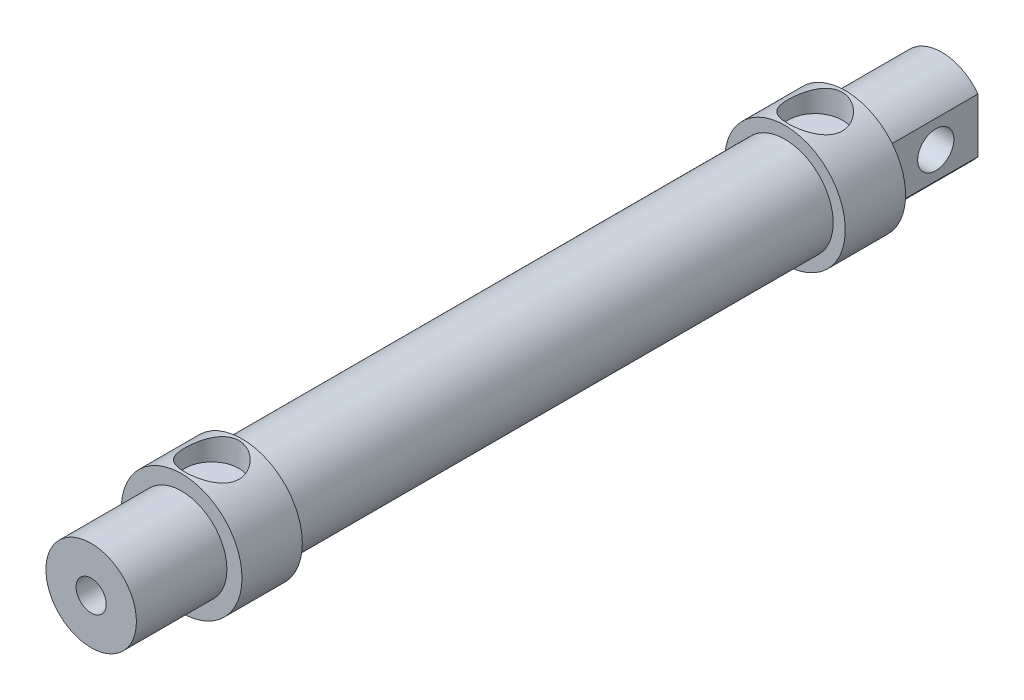
ISO-10303-21;
HEADER;
FILE_DESCRIPTION(('STEP AP214'),'2;1');
FILE_NAME('part.step','',(''),(''),'','','');
FILE_SCHEMA(('AUTOMOTIVE_DESIGN { 1 0 10303 214 1 1 1 1 }'));
ENDSEC;
DATA;
#1=APPLICATION_CONTEXT('core data for automotive mechanical design processes');
#2=APPLICATION_PROTOCOL_DEFINITION('international standard','automotive_design',2000,#1);
#3=PRODUCT_CONTEXT('',#1,'mechanical');
#4=PRODUCT('Part','Part','',(#3));
#5=PRODUCT_RELATED_PRODUCT_CATEGORY('part','',(#4));
#6=PRODUCT_DEFINITION_FORMATION('','',#4);
#7=PRODUCT_DEFINITION_CONTEXT('part definition',#1,'design');
#8=PRODUCT_DEFINITION('design','',#6,#7);
#9=PRODUCT_DEFINITION_SHAPE('','',#8);
#10=(LENGTH_UNIT() NAMED_UNIT(*) SI_UNIT(.MILLI.,.METRE.));
#11=(NAMED_UNIT(*) PLANE_ANGLE_UNIT() SI_UNIT($,.RADIAN.));
#12=(NAMED_UNIT(*) SI_UNIT($,.STERADIAN.) SOLID_ANGLE_UNIT());
#13=UNCERTAINTY_MEASURE_WITH_UNIT(LENGTH_MEASURE(1.E-05),#10,'distance_accuracy_value','');
#14=(GEOMETRIC_REPRESENTATION_CONTEXT(3) GLOBAL_UNCERTAINTY_ASSIGNED_CONTEXT((#13)) GLOBAL_UNIT_ASSIGNED_CONTEXT((#10,
#11,#12)) REPRESENTATION_CONTEXT('',''));
#15=CARTESIAN_POINT('',(0.,0.,0.));
#16=DIRECTION('',(0.,0.,1.));
#17=DIRECTION('',(1.,0.,0.));
#18=AXIS2_PLACEMENT_3D('',#15,#16,#17);
#19=CARTESIAN_POINT('',(0.,0.,-26.));
#20=DIRECTION('',(0.,0.,1.));
#21=DIRECTION('',(1.,0.,0.));
#22=AXIS2_PLACEMENT_3D('',#19,#20,#21);
#23=CYLINDRICAL_SURFACE('',#22,7.5);
#24=CARTESIAN_POINT('',(0.,0.,-26.));
#25=DIRECTION('',(0.,0.,-1.));
#26=DIRECTION('',(-1.,0.,0.));
#27=AXIS2_PLACEMENT_3D('',#24,#25,#26);
#28=CIRCLE('',#27,7.5);
#29=CARTESIAN_POINT('',(6.,-4.5,-26.));
#30=VERTEX_POINT('',#29);
#31=CARTESIAN_POINT('',(-6.,-4.5,-26.));
#32=VERTEX_POINT('',#31);
#33=EDGE_CURVE('E97',#30,#32,#28,.T.);
#34=ORIENTED_EDGE('',*,*,#33,.F.);
#35=DIRECTION('',(0.,0.,-1.));
#36=VECTOR('',#35,1.);
#37=CARTESIAN_POINT('',(6.,-4.5,-0.875856204552675));
#38=LINE('',#37,#36);
#39=CARTESIAN_POINT('',(6.,-4.5,-10.));
#40=VERTEX_POINT('',#39);
#41=EDGE_CURVE('E51',#40,#30,#38,.T.);
#42=ORIENTED_EDGE('',*,*,#41,.F.);
#43=CARTESIAN_POINT('',(0.,0.,-10.));
#44=DIRECTION('',(0.,0.,-1.));
#45=DIRECTION('',(-1.,0.,0.));
#46=AXIS2_PLACEMENT_3D('',#43,#44,#45);
#47=CIRCLE('',#46,7.5);
#48=CARTESIAN_POINT('',(-6.,-4.5,-10.));
#49=VERTEX_POINT('',#48);
#50=EDGE_CURVE('E107',#40,#49,#47,.T.);
#51=ORIENTED_EDGE('',*,*,#50,.T.);
#52=DIRECTION('',(0.,0.,-1.));
#53=VECTOR('',#52,1.);
#54=CARTESIAN_POINT('',(-6.,-4.5,-0.875856204552675));
#55=LINE('',#54,#53);
#56=EDGE_CURVE('E189',#49,#32,#55,.T.);
#57=ORIENTED_EDGE('',*,*,#56,.T.);
#58=EDGE_LOOP('',(#34,#42,#51,#57));
#59=FACE_BOUND('',#58,.T.);
#60=ADVANCED_FACE('F33',(#59),#23,.T.);
#61=CARTESIAN_POINT('',(0.,0.,-10.));
#62=DIRECTION('',(0.,0.,-1.));
#63=DIRECTION('',(-1.,0.,0.));
#64=AXIS2_PLACEMENT_3D('',#61,#62,#63);
#65=PLANE('',#64);
#66=CARTESIAN_POINT('',(0.,0.,-10.));
#67=DIRECTION('',(0.,0.,-1.));
#68=DIRECTION('',(-1.,0.,0.));
#69=AXIS2_PLACEMENT_3D('',#66,#67,#68);
#70=CIRCLE('',#69,10.);
#71=CARTESIAN_POINT('',(-10.,0.,-10.));
#72=VERTEX_POINT('',#71);
#73=EDGE_CURVE('E117',#72,#72,#70,.T.);
#74=ORIENTED_EDGE('',*,*,#73,.T.);
#75=EDGE_LOOP('',(#74));
#76=FACE_BOUND('',#75,.T.);
#77=CARTESIAN_POINT('',(-6.,4.5,-10.));
#78=VERTEX_POINT('',#77);
#79=CARTESIAN_POINT('',(6.,4.5,-10.));
#80=VERTEX_POINT('',#79);
#81=EDGE_CURVE('E91',#78,#80,#47,.T.);
#82=ORIENTED_EDGE('',*,*,#81,.F.);
#83=DIRECTION('',(0.,1.,0.));
#84=VECTOR('',#83,1.);
#85=CARTESIAN_POINT('',(-6.,4.5,-10.));
#86=LINE('',#85,#84);
#87=EDGE_CURVE('E197',#49,#78,#86,.T.);
#88=ORIENTED_EDGE('',*,*,#87,.F.);
#89=ORIENTED_EDGE('',*,*,#50,.F.);
#90=DIRECTION('',(0.,-1.,0.));
#91=VECTOR('',#90,1.);
#92=CARTESIAN_POINT('',(6.,4.5,-10.));
#93=LINE('',#92,#91);
#94=EDGE_CURVE('E92',#80,#40,#93,.T.);
#95=ORIENTED_EDGE('',*,*,#94,.F.);
#96=EDGE_LOOP('',(#82,#88,#89,#95));
#97=FACE_BOUND('',#96,.T.);
#98=ADVANCED_FACE('F165',(#76,#97),#65,.T.);
#99=CARTESIAN_POINT('',(0.,0.,100.));
#100=DIRECTION('',(0.,0.,1.));
#101=DIRECTION('',(1.,0.,0.));
#102=AXIS2_PLACEMENT_3D('',#99,#100,#101);
#103=PLANE('',#102);
#104=CARTESIAN_POINT('',(0.,0.,100.));
#105=DIRECTION('',(0.,0.,1.));
#106=DIRECTION('',(1.,0.,0.));
#107=AXIS2_PLACEMENT_3D('',#104,#105,#106);
#108=CIRCLE('',#107,10.);
#109=CARTESIAN_POINT('',(10.,0.,100.));
#110=VERTEX_POINT('',#109);
#111=EDGE_CURVE('E111',#110,#110,#108,.T.);
#112=ORIENTED_EDGE('',*,*,#111,.T.);
#113=EDGE_LOOP('',(#112));
#114=FACE_BOUND('',#113,.T.);
#115=CARTESIAN_POINT('',(0.,0.,100.));
#116=DIRECTION('',(0.,0.,1.));
#117=DIRECTION('',(1.,0.,0.));
#118=AXIS2_PLACEMENT_3D('',#115,#116,#117);
#119=CIRCLE('',#118,7.5);
#120=CARTESIAN_POINT('',(7.5,0.,100.));
#121=VERTEX_POINT('',#120);
#122=EDGE_CURVE('E96',#121,#121,#119,.T.);
#123=ORIENTED_EDGE('',*,*,#122,.F.);
#124=EDGE_LOOP('',(#123));
#125=FACE_BOUND('',#124,.T.);
#126=ADVANCED_FACE('F163',(#114,#125),#103,.T.);
#127=CARTESIAN_POINT('',(0.,0.,90.));
#128=DIRECTION('',(0.,0.,-1.));
#129=DIRECTION('',(-1.,0.,0.));
#130=AXIS2_PLACEMENT_3D('',#127,#128,#129);
#131=CYLINDRICAL_SURFACE('',#130,8.);
#132=CARTESIAN_POINT('',(0.,0.,90.));
#133=DIRECTION('',(0.,0.,1.));
#134=DIRECTION('',(1.,0.,0.));
#135=AXIS2_PLACEMENT_3D('',#132,#133,#134);
#136=CIRCLE('',#135,8.);
#137=CARTESIAN_POINT('',(-8.,0.,90.));
#138=VERTEX_POINT('',#137);
#139=EDGE_CURVE('E125',#138,#138,#136,.T.);
#140=CARTESIAN_POINT('',(0.,0.,0.));
#141=DIRECTION('',(0.,0.,-1.));
#142=DIRECTION('',(-1.,0.,0.));
#143=AXIS2_PLACEMENT_3D('',#140,#141,#142);
#144=CIRCLE('',#143,8.);
#145=CARTESIAN_POINT('',(-8.,0.,0.));
#146=VERTEX_POINT('',#145);
#147=EDGE_CURVE('E120',#146,#146,#144,.T.);
#148=CARTESIAN_POINT('',(-8.,0.,90.));
#149=CARTESIAN_POINT('',(-8.,0.,89.0625));
#150=CARTESIAN_POINT('',(-8.,0.,88.125));
#151=CARTESIAN_POINT('',(-8.,0.,86.25));
#152=CARTESIAN_POINT('',(-8.,0.,85.3125));
#153=CARTESIAN_POINT('',(-8.,0.,83.4375));
#154=CARTESIAN_POINT('',(-8.,0.,82.5));
#155=CARTESIAN_POINT('',(-8.,0.,80.625));
#156=CARTESIAN_POINT('',(-8.,0.,79.6875));
#157=CARTESIAN_POINT('',(-8.,0.,77.8125));
#158=CARTESIAN_POINT('',(-8.,0.,76.875));
#159=CARTESIAN_POINT('',(-8.,0.,75.));
#160=CARTESIAN_POINT('',(-8.,0.,74.0625));
#161=CARTESIAN_POINT('',(-8.,0.,72.1875));
#162=CARTESIAN_POINT('',(-8.,0.,71.25));
#163=CARTESIAN_POINT('',(-8.,0.,69.375));
#164=CARTESIAN_POINT('',(-8.,0.,68.4375));
#165=CARTESIAN_POINT('',(-8.,0.,66.5625));
#166=CARTESIAN_POINT('',(-8.,0.,65.625));
#167=CARTESIAN_POINT('',(-8.,0.,63.75));
#168=CARTESIAN_POINT('',(-8.,0.,62.8125));
#169=CARTESIAN_POINT('',(-8.,0.,60.9375));
#170=CARTESIAN_POINT('',(-8.,0.,60.));
#171=CARTESIAN_POINT('',(-8.,0.,58.125));
#172=CARTESIAN_POINT('',(-8.,0.,57.1875));
#173=CARTESIAN_POINT('',(-8.,0.,55.3125));
#174=CARTESIAN_POINT('',(-8.,0.,54.375));
#175=CARTESIAN_POINT('',(-8.,0.,52.5));
#176=CARTESIAN_POINT('',(-8.,0.,51.5625));
#177=CARTESIAN_POINT('',(-8.,0.,49.6875));
#178=CARTESIAN_POINT('',(-8.,0.,48.75));
#179=CARTESIAN_POINT('',(-8.,0.,46.875));
#180=CARTESIAN_POINT('',(-8.,0.,45.9375));
#181=CARTESIAN_POINT('',(-8.,0.,44.0625));
#182=CARTESIAN_POINT('',(-8.,0.,43.125));
#183=CARTESIAN_POINT('',(-8.,0.,41.25));
#184=CARTESIAN_POINT('',(-8.,0.,40.3125));
#185=CARTESIAN_POINT('',(-8.,0.,38.4375));
#186=CARTESIAN_POINT('',(-8.,0.,37.5));
#187=CARTESIAN_POINT('',(-8.,0.,35.625));
#188=CARTESIAN_POINT('',(-8.,0.,34.6875));
#189=CARTESIAN_POINT('',(-8.,0.,32.8125));
#190=CARTESIAN_POINT('',(-8.,0.,31.875));
#191=CARTESIAN_POINT('',(-8.,0.,30.));
#192=CARTESIAN_POINT('',(-8.,0.,29.0625));
#193=CARTESIAN_POINT('',(-8.,0.,27.1875));
#194=CARTESIAN_POINT('',(-8.,0.,26.25));
#195=CARTESIAN_POINT('',(-8.,0.,24.375));
#196=CARTESIAN_POINT('',(-8.,0.,23.4375));
#197=CARTESIAN_POINT('',(-8.,0.,21.5625));
#198=CARTESIAN_POINT('',(-8.,0.,20.625));
#199=CARTESIAN_POINT('',(-8.,0.,18.75));
#200=CARTESIAN_POINT('',(-8.,0.,17.8125));
#201=CARTESIAN_POINT('',(-8.,0.,15.9375));
#202=CARTESIAN_POINT('',(-8.,0.,15.));
#203=CARTESIAN_POINT('',(-8.,0.,13.125));
#204=CARTESIAN_POINT('',(-8.,0.,12.1875));
#205=CARTESIAN_POINT('',(-8.,0.,10.3125));
#206=CARTESIAN_POINT('',(-8.,0.,9.37500000000001));
#207=CARTESIAN_POINT('',(-8.,0.,7.50000000000002));
#208=CARTESIAN_POINT('',(-8.,0.,6.56250000000002));
#209=CARTESIAN_POINT('',(-8.,0.,4.68750000000002));
#210=CARTESIAN_POINT('',(-8.,0.,3.75000000000001));
#211=CARTESIAN_POINT('',(-8.,0.,1.87500000000001));
#212=CARTESIAN_POINT('',(-8.,0.,0.937500000000014));
#213=CARTESIAN_POINT('',(-8.,0.,0.));
#214=B_SPLINE_CURVE_WITH_KNOTS('',3,(#148,#149,#150,#151,#152,#153,#154,#155,#156,#157,#158,
#159,#160,#161,#162,#163,#164,#165,#166,#167,#168,#169,#170,#171,#172,#173,#174,#175,#176,#177,
#178,#179,#180,#181,#182,#183,#184,#185,#186,#187,#188,#189,#190,#191,#192,#193,#194,#195,#196,
#197,#198,#199,#200,#201,#202,#203,#204,#205,#206,#207,#208,#209,#210,#211,#212,#213),
.UNSPECIFIED.,.F.,.F.,(4,2,2,2,2,2,2,2,2,2,2,2,2,2,2,2,2,2,2,2,2,2,2,2,2,2,2,2,2,2,2,2,4),(0.,
2.8125,5.62499999999999,8.43749999999999,11.25,14.0625,16.875,19.6875,22.5,25.3125,28.125,
30.9375,33.75,36.5625,39.375,42.1875,45.,47.8125,50.625,53.4375,56.25,59.0625,61.875,64.6875,
67.5,70.3125,73.125,75.9375,78.75,81.5625,84.375,87.1875,90.),.UNSPECIFIED.);
#215=EDGE_CURVE('BSEAM35',#138,#146,#214,.T.);
#216=ORIENTED_EDGE('',*,*,#139,.F.);
#217=ORIENTED_EDGE('',*,*,#147,.F.);
#218=ORIENTED_EDGE('',*,*,#215,.T.);
#219=ORIENTED_EDGE('',*,*,#215,.F.);
#220=EDGE_LOOP('',(#216,#218,#217,#219));
#221=FACE_BOUND('',#220,.T.);
#222=ADVANCED_FACE('F35',(#221),#131,.T.);
#223=CARTESIAN_POINT('',(0.,0.,0.));
#224=DIRECTION('',(0.,0.,-1.));
#225=DIRECTION('',(-1.,0.,0.));
#226=AXIS2_PLACEMENT_3D('',#223,#224,#225);
#227=PLANE('',#226);
#228=CARTESIAN_POINT('',(0.,0.,0.));
#229=DIRECTION('',(0.,0.,-1.));
#230=DIRECTION('',(-1.,0.,0.));
#231=AXIS2_PLACEMENT_3D('',#228,#229,#230);
#232=CIRCLE('',#231,10.);
#233=CARTESIAN_POINT('',(-10.,0.,0.));
#234=VERTEX_POINT('',#233);
#235=EDGE_CURVE('E114',#234,#234,#232,.T.);
#236=ORIENTED_EDGE('',*,*,#235,.F.);
#237=EDGE_LOOP('',(#236));
#238=FACE_BOUND('',#237,.T.);
#239=ORIENTED_EDGE('',*,*,#147,.T.);
#240=EDGE_LOOP('',(#239));
#241=FACE_BOUND('',#240,.T.);
#242=ADVANCED_FACE('F176',(#238,#241),#227,.F.);
#243=CARTESIAN_POINT('',(0.,0.,-10.));
#244=DIRECTION('',(0.,0.,1.));
#245=DIRECTION('',(1.,0.,0.));
#246=AXIS2_PLACEMENT_3D('',#243,#244,#245);
#247=CYLINDRICAL_SURFACE('',#246,10.);
#248=CARTESIAN_POINT('',(0.,10.,-0.5));
#249=CARTESIAN_POINT('',(-0.119714899377499,9.9999992514518,-0.500000890002053));
#250=CARTESIAN_POINT('',(-0.239458239717201,9.99784463505232,-0.504783412476652));
#251=CARTESIAN_POINT('',(-0.478080983317484,9.98927965727141,-0.523865659464688));
#252=CARTESIAN_POINT('',(-0.596959866644426,9.98286691941227,-0.5381706985508));
#253=CARTESIAN_POINT('',(-0.833135767847142,9.96593822146435,-0.576176454268108));
#254=CARTESIAN_POINT('',(-0.95042948162941,9.95541475137588,-0.599894368791951));
#255=CARTESIAN_POINT('',(-1.18241652499653,9.93053425585604,-0.656481215828374));
#256=CARTESIAN_POINT('',(-1.29710877072352,9.9161756632967,-0.689353889441735));
#257=CARTESIAN_POINT('',(-1.52263079506398,9.88405335147029,-0.76377129881031));
#258=CARTESIAN_POINT('',(-1.63347432992206,9.86630365187219,-0.805280390300351));
#259=CARTESIAN_POINT('',(-1.85112746101417,9.82779572783996,-0.896674636814239));
#260=CARTESIAN_POINT('',(-1.95793552697273,9.80703637627835,-0.94656293099961));
#261=CARTESIAN_POINT('',(-2.27123792734134,9.74098955379221,-1.10813742169027));
#262=CARTESIAN_POINT('',(-2.47089116747384,9.6918914827054,-1.23182671204988));
#263=CARTESIAN_POINT('',(-2.85732103985941,9.58530406137092,-1.51487693309343));
#264=CARTESIAN_POINT('',(-3.0428957633747,9.52751186527258,-1.67575321002514));
#265=CARTESIAN_POINT('',(-3.38550875317661,9.4112213394932,-2.02538852490223));
#266=CARTESIAN_POINT('',(-3.5425295803198,9.35272260139618,-2.21416447571153));
#267=CARTESIAN_POINT('',(-3.83290348383043,9.23768019338741,-2.6280080759245));
#268=CARTESIAN_POINT('',(-3.96429017948437,9.18146042532477,-2.85456750336845));
#269=CARTESIAN_POINT('',(-4.13093390700541,9.10708951066568,-3.2104155566));
#270=CARTESIAN_POINT('',(-4.18142203880366,9.08395233098873,-3.33174721937629));
#271=CARTESIAN_POINT('',(-4.27176580262694,9.04181979927299,-3.57897853706182));
#272=CARTESIAN_POINT('',(-4.31162720701697,9.02282219967141,-3.70487566964333));
#273=CARTESIAN_POINT('',(-4.37841999028415,8.99059179237455,-3.95351636569529));
#274=CARTESIAN_POINT('',(-4.40592440136942,8.97710693927065,-4.07607376082319));
#275=CARTESIAN_POINT('',(-4.45062326107638,8.95503078908064,-4.32343771638688));
#276=CARTESIAN_POINT('',(-4.46782272017156,8.94643711390801,-4.44824315332329));
#277=CARTESIAN_POINT('',(-4.49169233969261,8.93447700956661,-4.69906118347091));
#278=CARTESIAN_POINT('',(-4.49836639340772,8.93110864759093,-4.82507331297275));
#279=CARTESIAN_POINT('',(-4.50110340099379,8.92972961454464,-5.07723625895438));
#280=CARTESIAN_POINT('',(-4.49716706417789,8.93171858533204,-5.20338706559995));
#281=CARTESIAN_POINT('',(-4.47959284063994,8.94054436393744,-5.4430787367774));
#282=CARTESIAN_POINT('',(-4.46688667651571,8.94691540416729,-5.55670597513979));
#283=CARTESIAN_POINT('',(-4.43293658086699,8.96378380003499,-5.78237804022222));
#284=CARTESIAN_POINT('',(-4.41168989784837,8.97428248545005,-5.8944223449158));
#285=CARTESIAN_POINT('',(-4.33544598173778,9.011503722142,-6.22699755312078));
#286=CARTESIAN_POINT('',(-4.26793076595448,9.04395916378106,-6.44415783870878));
#287=CARTESIAN_POINT('',(-4.10015888915263,9.12125693016516,-6.86871203227035));
#288=CARTESIAN_POINT('',(-3.99919587349869,9.16636294593646,-7.07577372133454));
#289=CARTESIAN_POINT('',(-3.76787528527297,9.26384610310325,-7.47093999468946));
#290=CARTESIAN_POINT('',(-3.63750520457291,9.31622633489086,-7.65903646282433));
#291=CARTESIAN_POINT('',(-3.33583227515682,9.4287142395038,-8.03069920903984));
#292=CARTESIAN_POINT('',(-3.16173786385567,9.48907048526043,-8.21192585812123));
#293=CARTESIAN_POINT('',(-2.78500415457925,9.60638078718318,-8.54353558496202));
#294=CARTESIAN_POINT('',(-2.58235582919845,9.66333375925335,-8.69390887126685));
#295=CARTESIAN_POINT('',(-2.25721570243328,9.74258846497997,-8.89512020664333));
#296=CARTESIAN_POINT('',(-2.1433872205526,9.76832203062482,-8.95891242814095));
#297=CARTESIAN_POINT('',(-1.91009036946106,9.81660379138816,-9.07659125533208));
#298=CARTESIAN_POINT('',(-1.79062435375876,9.83915330033476,-9.13048194944534));
#299=CARTESIAN_POINT('',(-1.54690648548244,9.88040267650027,-9.22780064333651));
#300=CARTESIAN_POINT('',(-1.42265607187478,9.89910369063005,-9.27123176088862));
#301=CARTESIAN_POINT('',(-1.17028710145184,9.93210014831025,-9.34715821062613));
#302=CARTESIAN_POINT('',(-1.04216889591685,9.94639599063306,-9.37965453269401));
#303=CARTESIAN_POINT('',(-0.792376984920266,9.96928945175045,-9.43139136776798));
#304=CARTESIAN_POINT('',(-0.670894892411247,9.97822061403935,-9.45141166745289));
#305=CARTESIAN_POINT('',(-0.426459268412432,9.9916520406954,-9.48143859694167));
#306=CARTESIAN_POINT('',(-0.303505835771769,9.99615260105112,-9.4914458956698));
#307=CARTESIAN_POINT('',(-0.0571459633958022,10.0005953916074,-9.50132510559218));
#308=CARTESIAN_POINT('',(0.0662603342467419,10.0005389466492,-9.50119996255352));
#309=CARTESIAN_POINT('',(0.312555788056655,9.99587319016683,-9.49082418918375));
#310=CARTESIAN_POINT('',(0.435444959409023,9.99126401328015,-9.48057385828387));
#311=CARTESIAN_POINT('',(0.67237330219901,9.97803225420679,-9.45098782056628));
#312=CARTESIAN_POINT('',(0.786500047827908,9.9696678602719,-9.4322359240705));
#313=CARTESIAN_POINT('',(1.01266797335818,9.94924261322972,-9.38609693677835));
#314=CARTESIAN_POINT('',(1.12470846873294,9.93718056877868,-9.35870706283538));
#315=CARTESIAN_POINT('',(1.45652628438278,9.89585863600817,-9.26395657040564));
#316=CARTESIAN_POINT('',(1.67220954839673,9.86145048700206,-9.18398844309207));
#317=CARTESIAN_POINT('',(2.09364161657217,9.78081050149538,-8.99026516024635));
#318=CARTESIAN_POINT('',(2.29887244489482,9.7342440610747,-8.87553607676711));
#319=CARTESIAN_POINT('',(2.68794274227257,9.63407218762379,-8.61657138991768));
#320=CARTESIAN_POINT('',(2.87177279900524,9.58046367930153,-8.47232287988325));
#321=CARTESIAN_POINT('',(3.22874481881242,9.46642342235631,-8.14462956850864));
#322=CARTESIAN_POINT('',(3.39975739919774,9.40579345325527,-7.95893420918039));
#323=CARTESIAN_POINT('',(3.7089928529427,9.28820745525924,-7.56063731302618));
#324=CARTESIAN_POINT('',(3.84720314960723,9.23125284160317,-7.3480255039413));
#325=CARTESIAN_POINT('',(4.02836218298274,9.15296575683414,-7.00979638048813));
#326=CARTESIAN_POINT('',(4.08494101420093,9.12778463759271,-6.89218603099664));
#327=CARTESIAN_POINT('',(4.18787248114614,9.08101974034093,-6.65190156568623));
#328=CARTESIAN_POINT('',(4.2342296566971,9.05943436636988,-6.52922972672152));
#329=CARTESIAN_POINT('',(4.31618722109356,9.02067545662568,-6.27975073171213));
#330=CARTESIAN_POINT('',(4.35179413888921,9.00349924399134,-6.15294613767421));
#331=CARTESIAN_POINT('',(4.41183693193977,8.97423060317641,-5.89614401561104));
#332=CARTESIAN_POINT('',(4.43627411415682,8.96213758022901,-5.76614686302123));
#333=CARTESIAN_POINT('',(4.47202091449907,8.94434960712291,-5.51541826278566));
#334=CARTESIAN_POINT('',(4.4842807024604,8.93819292562724,-5.39485427283057));
#335=CARTESIAN_POINT('',(4.49903019914858,8.93077809281634,-5.15298260566588));
#336=CARTESIAN_POINT('',(4.5015205682304,8.92951961041187,-5.0316749792769));
#337=CARTESIAN_POINT('',(4.49669929744397,8.93194839334479,-4.7893299111345));
#338=CARTESIAN_POINT('',(4.48938957603767,8.93563469069406,-4.66829242114495));
#339=CARTESIAN_POINT('',(4.46506798264277,8.94781267924994,-4.42744554285085));
#340=CARTESIAN_POINT('',(4.44805628051732,8.95630428632473,-4.30763613308236));
#341=CARTESIAN_POINT('',(4.40592367546869,8.97710145887841,-4.07771284236705));
#342=CARTESIAN_POINT('',(4.38138644823706,8.98913052816038,-3.96746647533706));
#343=CARTESIAN_POINT('',(4.3242379973795,9.016760258177,-3.74953045357018));
#344=CARTESIAN_POINT('',(4.29162401522606,9.03236213902907,-3.64184168615339));
#345=CARTESIAN_POINT('',(4.18209790413275,9.08386579740127,-3.3236018253385));
#346=CARTESIAN_POINT('',(4.09347240108939,9.12448081079357,-3.11772001581903));
#347=CARTESIAN_POINT('',(3.88104703097752,9.21692269648097,-2.71007954773134));
#348=CARTESIAN_POINT('',(3.75534202990489,9.26930504512267,-2.50944994717334));
#349=CARTESIAN_POINT('',(3.47477312444683,9.37809249113928,-2.13093860235509));
#350=CARTESIAN_POINT('',(3.31989665958057,9.43449931482618,-1.95306671258599));
#351=CARTESIAN_POINT('',(2.96865270415693,9.55113675133759,-1.60841002335675));
#352=CARTESIAN_POINT('',(2.7697974169835,9.61125079600769,-1.44408972325795));
#353=CARTESIAN_POINT('',(2.451697736392,9.69542725222155,-1.22430517835498));
#354=CARTESIAN_POINT('',(2.34226381477152,9.7225067115913,-1.15544749171922));
#355=CARTESIAN_POINT('',(2.11740450774386,9.77393805362308,-1.02717708698299));
#356=CARTESIAN_POINT('',(2.00198193536715,9.79829120023319,-0.967759986722742));
#357=CARTESIAN_POINT('',(1.76699253742287,9.84336943677559,-0.85942943181218));
#358=CARTESIAN_POINT('',(1.64747506142007,9.8641265763463,-0.81042220355186));
#359=CARTESIAN_POINT('',(1.40416398949856,9.90168985287585,-0.722730737933654));
#360=CARTESIAN_POINT('',(1.28037249014286,9.91849789629377,-0.684041518247569));
#361=CARTESIAN_POINT('',(1.02972097012304,9.94764083982698,-0.617483426496842));
#362=CARTESIAN_POINT('',(0.90286899929365,9.95998634549706,-0.589588888767578));
#363=CARTESIAN_POINT('',(0.64692353237821,9.97987682190862,-0.544851730685118));
#364=CARTESIAN_POINT('',(0.517831638287638,9.98742508914182,-0.528001520812594));
#365=CARTESIAN_POINT('',(0.32368296793252,9.99496914098584,-0.511188557769922));
#366=CARTESIAN_POINT('',(0.259036146622593,9.99685406786943,-0.506994634848498));
#367=CARTESIAN_POINT('',(0.129595662689027,9.99936970855439,-0.501400095969313));
#368=CARTESIAN_POINT('',(0.0648019980679326,10.0000004051912,-0.499999518239486));
#369=CARTESIAN_POINT('',(0.,10.,-0.5));
#370=B_SPLINE_CURVE_WITH_KNOTS('',3,(#248,#249,#250,#251,#252,#253,#254,#255,#256,#257,#258,
#259,#260,#261,#262,#263,#264,#265,#266,#267,#268,#269,#270,#271,#272,#273,#274,#275,#276,#277,
#278,#279,#280,#281,#282,#283,#284,#285,#286,#287,#288,#289,#290,#291,#292,#293,#294,#295,#296,
#297,#298,#299,#300,#301,#302,#303,#304,#305,#306,#307,#308,#309,#310,#311,#312,#313,#314,#315,
#316,#317,#318,#319,#320,#321,#322,#323,#324,#325,#326,#327,#328,#329,#330,#331,#332,#333,#334,
#335,#336,#337,#338,#339,#340,#341,#342,#343,#344,#345,#346,#347,#348,#349,#350,#351,#352,#353,
#354,#355,#356,#357,#358,#359,#360,#361,#362,#363,#364,#365,#366,#367,#368,#369),.UNSPECIFIED.,
.T.,.F.,(4,2,2,2,2,2,2,2,2,2,2,2,2,2,2,2,2,2,2,2,2,2,2,2,2,2,2,2,2,2,2,2,2,2,2,2,2,2,2,2,2,2,2,
2,2,2,2,2,2,2,2,2,2,2,2,2,2,2,2,2,4),(0.,0.359079766319795,0.718360105383011,1.07829991585421,
1.43838703244486,1.79701647223383,2.15578056888792,2.87242277909538,3.62616960499523,
4.38037524297132,5.17949629217535,5.57935055595989,5.9789871770606,6.35745629849475,
6.73574125103079,7.11388624520866,7.49200596071636,7.83512607615004,8.1783568231084,
8.86426196528475,9.56568894241472,10.2674148320078,11.0394072404648,11.8116442665593,
12.2102018577121,12.6085945095896,13.0068682618196,13.4051059502435,13.7749562785481,
14.1447818971397,14.514499998092,14.8842071657334,15.2316678829995,15.579240666289,
16.2737589298737,16.9898887001225,17.7063322525595,18.4818198750701,19.2576043480189,
19.6559156754215,20.0540497397624,20.4519415168204,20.8497867249427,21.2133308553316,
21.5768504118624,21.9402988163336,22.3037408577126,22.6440991624995,22.9845738736592,
23.6650470945947,24.3895568934342,25.1143793636261,25.9048702890336,26.3007656588533,
26.6964767204835,27.0884558939879,27.4802454456701,27.8710976613984,28.2616810061527,
28.4560491926108,28.6504200390491),.UNSPECIFIED.);
#371=CARTESIAN_POINT('',(0.,10.,-0.5));
#372=VERTEX_POINT('',#371);
#373=EDGE_CURVE('E11',#372,#372,#370,.T.);
#374=ORIENTED_EDGE('',*,*,#373,.T.);
#375=EDGE_LOOP('',(#374));
#376=FACE_BOUND('',#375,.T.);
#377=ORIENTED_EDGE('',*,*,#73,.F.);
#378=EDGE_LOOP('',(#377));
#379=FACE_BOUND('',#378,.T.);
#380=ORIENTED_EDGE('',*,*,#235,.T.);
#381=EDGE_LOOP('',(#380));
#382=FACE_BOUND('',#381,.T.);
#383=ADVANCED_FACE('F169',(#376,#379,#382),#247,.T.);
#384=CARTESIAN_POINT('',(0.,0.,90.));
#385=DIRECTION('',(0.,0.,1.));
#386=DIRECTION('',(1.,0.,0.));
#387=AXIS2_PLACEMENT_3D('',#384,#385,#386);
#388=PLANE('',#387);
#389=CARTESIAN_POINT('',(0.,0.,90.));
#390=DIRECTION('',(0.,0.,1.));
#391=DIRECTION('',(1.,0.,0.));
#392=AXIS2_PLACEMENT_3D('',#389,#390,#391);
#393=CIRCLE('',#392,10.);
#394=CARTESIAN_POINT('',(10.,0.,90.));
#395=VERTEX_POINT('',#394);
#396=EDGE_CURVE('E109',#395,#395,#393,.T.);
#397=ORIENTED_EDGE('',*,*,#396,.F.);
#398=EDGE_LOOP('',(#397));
#399=FACE_BOUND('',#398,.T.);
#400=ORIENTED_EDGE('',*,*,#139,.T.);
#401=EDGE_LOOP('',(#400));
#402=FACE_BOUND('',#401,.T.);
#403=ADVANCED_FACE('F167',(#399,#402),#388,.F.);
#404=CARTESIAN_POINT('',(0.,0.,100.));
#405=DIRECTION('',(0.,0.,-1.));
#406=DIRECTION('',(-1.,0.,0.));
#407=AXIS2_PLACEMENT_3D('',#404,#405,#406);
#408=CYLINDRICAL_SURFACE('',#407,10.);
#409=CARTESIAN_POINT('',(0.,10.,99.5));
#410=CARTESIAN_POINT('',(-0.119714899377498,9.9999992514518,99.4999991099979));
#411=CARTESIAN_POINT('',(-0.2394582397172,9.99784463505232,99.4952165875234));
#412=CARTESIAN_POINT('',(-0.478080983317483,9.98927965727141,99.4761343405353));
#413=CARTESIAN_POINT('',(-0.596959866644424,9.98286691941227,99.4618293014492));
#414=CARTESIAN_POINT('',(-0.833135767847141,9.96593822146435,99.4238235457319));
#415=CARTESIAN_POINT('',(-0.950429481629408,9.95541475137588,99.400105631208));
#416=CARTESIAN_POINT('',(-1.18241652499653,9.93053425585604,99.3435187841716));
#417=CARTESIAN_POINT('',(-1.29710877072352,9.9161756632967,99.3106461105583));
#418=CARTESIAN_POINT('',(-1.52263079506397,9.88405335147029,99.2362287011897));
#419=CARTESIAN_POINT('',(-1.63347432992206,9.86630365187219,99.1947196096996));
#420=CARTESIAN_POINT('',(-1.85112746101416,9.82779572783996,99.1033253631858));
#421=CARTESIAN_POINT('',(-1.95793552697272,9.80703637627835,99.0534370690004));
#422=CARTESIAN_POINT('',(-2.27123792734133,9.74098955379221,98.8918625783097));
#423=CARTESIAN_POINT('',(-2.47089116747383,9.6918914827054,98.7681732879501));
#424=CARTESIAN_POINT('',(-2.85732103985941,9.58530406137092,98.4851230669066));
#425=CARTESIAN_POINT('',(-3.04289576337469,9.52751186527258,98.3242467899749));
#426=CARTESIAN_POINT('',(-3.38550875317661,9.4112213394932,97.9746114750978));
#427=CARTESIAN_POINT('',(-3.54252958031979,9.35272260139618,97.7858355242885));
#428=CARTESIAN_POINT('',(-3.83290348383043,9.23768019338741,97.3719919240755));
#429=CARTESIAN_POINT('',(-3.96429017948437,9.18146042532476,97.1454324966315));
#430=CARTESIAN_POINT('',(-4.13093390700542,9.10708951066567,96.7895844434));
#431=CARTESIAN_POINT('',(-4.18142203880367,9.08395233098873,96.6682527806237));
#432=CARTESIAN_POINT('',(-4.27176580262694,9.04181979927299,96.4210214629382));
#433=CARTESIAN_POINT('',(-4.31162720701697,9.02282219967141,96.2951243303567));
#434=CARTESIAN_POINT('',(-4.37841999028415,8.99059179237455,96.0464836343047));
#435=CARTESIAN_POINT('',(-4.40592440136942,8.97710693927065,95.9239262391768));
#436=CARTESIAN_POINT('',(-4.45062326107638,8.95503078908064,95.6765622836131));
#437=CARTESIAN_POINT('',(-4.46782272017156,8.94643711390801,95.5517568466767));
#438=CARTESIAN_POINT('',(-4.49169233969261,8.93447700956661,95.3009388165291));
#439=CARTESIAN_POINT('',(-4.49836639340772,8.93110864759093,95.1749266870273));
#440=CARTESIAN_POINT('',(-4.50110340099379,8.92972961454464,94.9227637410456));
#441=CARTESIAN_POINT('',(-4.49716706417789,8.93171858533204,94.7966129344001));
#442=CARTESIAN_POINT('',(-4.47959284063995,8.94054436393744,94.5569212632226));
#443=CARTESIAN_POINT('',(-4.46688667651572,8.94691540416729,94.4432940248602));
#444=CARTESIAN_POINT('',(-4.432936580867,8.96378380003499,94.2176219597778));
#445=CARTESIAN_POINT('',(-4.41168989784837,8.97428248545005,94.1055776550842));
#446=CARTESIAN_POINT('',(-4.33544598173778,9.01150372214199,93.7730024468792));
#447=CARTESIAN_POINT('',(-4.26793076595449,9.04395916378106,93.5558421612912));
#448=CARTESIAN_POINT('',(-4.10015888915264,9.12125693016516,93.1312879677297));
#449=CARTESIAN_POINT('',(-3.99919587349869,9.16636294593646,92.9242262786655));
#450=CARTESIAN_POINT('',(-3.76787528527297,9.26384610310325,92.5290600053105));
#451=CARTESIAN_POINT('',(-3.63750520457291,9.31622633489086,92.3409635371757));
#452=CARTESIAN_POINT('',(-3.33583227515681,9.4287142395038,91.9693007909601));
#453=CARTESIAN_POINT('',(-3.16173786385566,9.48907048526043,91.7880741418788));
#454=CARTESIAN_POINT('',(-2.78500415457925,9.60638078718318,91.456464415038));
#455=CARTESIAN_POINT('',(-2.58235582919844,9.66333375925335,91.3060911287332));
#456=CARTESIAN_POINT('',(-2.25721570243329,9.74258846497997,91.1048797933567));
#457=CARTESIAN_POINT('',(-2.1433872205526,9.76832203062482,91.0410875718591));
#458=CARTESIAN_POINT('',(-1.91009036946107,9.81660379138815,90.9234087446679));
#459=CARTESIAN_POINT('',(-1.79062435375876,9.83915330033476,90.8695180505547));
#460=CARTESIAN_POINT('',(-1.54690648548245,9.88040267650027,90.7721993566635));
#461=CARTESIAN_POINT('',(-1.42265607187479,9.89910369063005,90.7287682391114));
#462=CARTESIAN_POINT('',(-1.17028710145185,9.93210014831025,90.6528417893739));
#463=CARTESIAN_POINT('',(-1.04216889591686,9.94639599063306,90.620345467306));
#464=CARTESIAN_POINT('',(-0.792376984920276,9.96928945175045,90.568608632232));
#465=CARTESIAN_POINT('',(-0.670894892411257,9.97822061403935,90.5485883325471));
#466=CARTESIAN_POINT('',(-0.426459268412441,9.9916520406954,90.5185614030583));
#467=CARTESIAN_POINT('',(-0.303505835771778,9.99615260105112,90.5085541043302));
#468=CARTESIAN_POINT('',(-0.0571459633958104,10.0005953916074,90.4986748944078));
#469=CARTESIAN_POINT('',(0.0662603342467328,10.0005389466492,90.4988000374465));
#470=CARTESIAN_POINT('',(0.312555788056646,9.99587319016683,90.5091758108162));
#471=CARTESIAN_POINT('',(0.435444959409015,9.99126401328015,90.5194261417161));
#472=CARTESIAN_POINT('',(0.672373302199003,9.97803225420679,90.5490121794337));
#473=CARTESIAN_POINT('',(0.786500047827901,9.9696678602719,90.5677640759295));
#474=CARTESIAN_POINT('',(1.01266797335818,9.94924261322972,90.6139030632216));
#475=CARTESIAN_POINT('',(1.12470846873293,9.93718056877868,90.6412929371646));
#476=CARTESIAN_POINT('',(1.45652628438277,9.89585863600817,90.7360434295943));
#477=CARTESIAN_POINT('',(1.67220954839672,9.86145048700206,90.8160115569079));
#478=CARTESIAN_POINT('',(2.09364161657216,9.78081050149538,91.0097348397536));
#479=CARTESIAN_POINT('',(2.29887244489481,9.7342440610747,91.1244639232329));
#480=CARTESIAN_POINT('',(2.68794274227256,9.63407218762379,91.3834286100823));
#481=CARTESIAN_POINT('',(2.87177279900524,9.58046367930154,91.5276771201167));
#482=CARTESIAN_POINT('',(3.22874481881242,9.46642342235632,91.8553704314914));
#483=CARTESIAN_POINT('',(3.39975739919774,9.40579345325527,92.0410657908196));
#484=CARTESIAN_POINT('',(3.7089928529427,9.28820745525924,92.4393626869738));
#485=CARTESIAN_POINT('',(3.84720314960723,9.23125284160317,92.6519744960587));
#486=CARTESIAN_POINT('',(4.02836218298274,9.15296575683414,92.9902036195119));
#487=CARTESIAN_POINT('',(4.08494101420093,9.12778463759271,93.1078139690034));
#488=CARTESIAN_POINT('',(4.18787248114614,9.08101974034093,93.3480984343138));
#489=CARTESIAN_POINT('',(4.2342296566971,9.05943436636988,93.4707702732785));
#490=CARTESIAN_POINT('',(4.31618722109356,9.02067545662568,93.7202492682879));
#491=CARTESIAN_POINT('',(4.35179413888921,9.00349924399134,93.8470538623258));
#492=CARTESIAN_POINT('',(4.41183693193977,8.97423060317641,94.1038559843889));
#493=CARTESIAN_POINT('',(4.43627411415682,8.96213758022901,94.2338531369788));
#494=CARTESIAN_POINT('',(4.47202091449907,8.94434960712292,94.4845817372143));
#495=CARTESIAN_POINT('',(4.4842807024604,8.93819292562724,94.6051457271694));
#496=CARTESIAN_POINT('',(4.49903019914858,8.93077809281634,94.8470173943341));
#497=CARTESIAN_POINT('',(4.5015205682304,8.92951961041187,94.9683250207231));
#498=CARTESIAN_POINT('',(4.49669929744397,8.93194839334479,95.2106700888655));
#499=CARTESIAN_POINT('',(4.48938957603767,8.93563469069406,95.331707578855));
#500=CARTESIAN_POINT('',(4.46506798264277,8.94781267924994,95.5725544571491));
#501=CARTESIAN_POINT('',(4.44805628051733,8.95630428632473,95.6923638669176));
#502=CARTESIAN_POINT('',(4.40592367546869,8.97710145887841,95.9222871576329));
#503=CARTESIAN_POINT('',(4.38138644823706,8.98913052816038,96.0325335246629));
#504=CARTESIAN_POINT('',(4.32423799737951,9.016760258177,96.2504695464298));
#505=CARTESIAN_POINT('',(4.29162401522606,9.03236213902907,96.3581583138466));
#506=CARTESIAN_POINT('',(4.18209790413275,9.08386579740127,96.6763981746615));
#507=CARTESIAN_POINT('',(4.09347240108938,9.12448081079357,96.882279984181));
#508=CARTESIAN_POINT('',(3.88104703097752,9.21692269648097,97.2899204522687));
#509=CARTESIAN_POINT('',(3.75534202990488,9.26930504512267,97.4905500528267));
#510=CARTESIAN_POINT('',(3.47477312444682,9.37809249113928,97.8690613976449));
#511=CARTESIAN_POINT('',(3.31989665958057,9.43449931482618,98.046933287414));
#512=CARTESIAN_POINT('',(2.96865270415693,9.55113675133759,98.3915899766433));
#513=CARTESIAN_POINT('',(2.7697974169835,9.61125079600769,98.555910276742));
#514=CARTESIAN_POINT('',(2.45169773639201,9.69542725222155,98.775694821645));
#515=CARTESIAN_POINT('',(2.34226381477153,9.7225067115913,98.8445525082808));
#516=CARTESIAN_POINT('',(2.11740450774387,9.77393805362308,98.972822913017));
#517=CARTESIAN_POINT('',(2.00198193536716,9.79829120023319,99.0322400132772));
#518=CARTESIAN_POINT('',(1.76699253742288,9.84336943677559,99.1405705681878));
#519=CARTESIAN_POINT('',(1.64747506142009,9.8641265763463,99.1895777964481));
#520=CARTESIAN_POINT('',(1.40416398949857,9.90168985287585,99.2772692620663));
#521=CARTESIAN_POINT('',(1.28037249014287,9.91849789629376,99.3159584817524));
#522=CARTESIAN_POINT('',(1.02972097012305,9.94764083982698,99.3825165735032));
#523=CARTESIAN_POINT('',(0.90286899929366,9.95998634549706,99.4104111112324));
#524=CARTESIAN_POINT('',(0.646923532378218,9.97987682190862,99.4551482693149));
#525=CARTESIAN_POINT('',(0.517831638287646,9.98742508914182,99.4719984791874));
#526=CARTESIAN_POINT('',(0.323682967932526,9.99496914098584,99.4888114422301));
#527=CARTESIAN_POINT('',(0.259036146622598,9.99685406786943,99.4930053651515));
#528=CARTESIAN_POINT('',(0.12959566268903,9.99936970855439,99.4985999040307));
#529=CARTESIAN_POINT('',(0.0648019980679339,10.0000004051912,99.5000004817605));
#530=CARTESIAN_POINT('',(0.,10.,99.5));
#531=B_SPLINE_CURVE_WITH_KNOTS('',3,(#409,#410,#411,#412,#413,#414,#415,#416,#417,#418,#419,
#420,#421,#422,#423,#424,#425,#426,#427,#428,#429,#430,#431,#432,#433,#434,#435,#436,#437,#438,
#439,#440,#441,#442,#443,#444,#445,#446,#447,#448,#449,#450,#451,#452,#453,#454,#455,#456,#457,
#458,#459,#460,#461,#462,#463,#464,#465,#466,#467,#468,#469,#470,#471,#472,#473,#474,#475,#476,
#477,#478,#479,#480,#481,#482,#483,#484,#485,#486,#487,#488,#489,#490,#491,#492,#493,#494,#495,
#496,#497,#498,#499,#500,#501,#502,#503,#504,#505,#506,#507,#508,#509,#510,#511,#512,#513,#514,
#515,#516,#517,#518,#519,#520,#521,#522,#523,#524,#525,#526,#527,#528,#529,#530),.UNSPECIFIED.,
.T.,.F.,(4,2,2,2,2,2,2,2,2,2,2,2,2,2,2,2,2,2,2,2,2,2,2,2,2,2,2,2,2,2,2,2,2,2,2,2,2,2,2,2,2,2,2,
2,2,2,2,2,2,2,2,2,2,2,2,2,2,2,2,2,4),(0.,0.359079766319794,0.71836010538301,1.07829991585421,
1.43838703244486,1.79701647223382,2.15578056888791,2.87242277909538,3.62616960499522,
4.38037524297132,5.17949629217536,5.57935055595991,5.97898717706061,6.35745629849476,
6.73574125103079,7.11388624520865,7.49200596071636,7.83512607615001,8.17835682310837,
8.86426196528473,9.56568894241472,10.2674148320079,11.0394072404648,11.8116442665593,
12.2102018577121,12.6085945095896,13.0068682618196,13.4051059502435,13.7749562785481,
14.1447818971397,14.514499998092,14.8842071657334,15.2316678829995,15.579240666289,
16.2737589298737,16.9898887001225,17.7063322525595,18.4818198750701,19.2576043480189,
19.6559156754215,20.0540497397624,20.4519415168204,20.8497867249427,21.2133308553316,
21.5768504118624,21.9402988163336,22.3037408577126,22.6440991624995,22.9845738736592,
23.6650470945947,24.3895568934343,25.1143793636261,25.9048702890336,26.3007656588533,
26.6964767204835,27.0884558939879,27.4802454456701,27.8710976613984,28.2616810061527,
28.4560491926108,28.6504200390491),.UNSPECIFIED.);
#532=CARTESIAN_POINT('',(0.,10.,99.5));
#533=VERTEX_POINT('',#532);
#534=EDGE_CURVE('E44',#533,#533,#531,.T.);
#535=ORIENTED_EDGE('',*,*,#534,.T.);
#536=EDGE_LOOP('',(#535));
#537=FACE_BOUND('',#536,.T.);
#538=ORIENTED_EDGE('',*,*,#111,.F.);
#539=EDGE_LOOP('',(#538));
#540=FACE_BOUND('',#539,.T.);
#541=ORIENTED_EDGE('',*,*,#396,.T.);
#542=EDGE_LOOP('',(#541));
#543=FACE_BOUND('',#542,.T.);
#544=ADVANCED_FACE('F132',(#537,#540,#543),#408,.T.);
#545=CARTESIAN_POINT('',(0.,0.,115.));
#546=DIRECTION('',(0.,0.,-1.));
#547=DIRECTION('',(-1.,0.,0.));
#548=AXIS2_PLACEMENT_3D('',#545,#546,#547);
#549=CYLINDRICAL_SURFACE('',#548,7.5);
#550=CARTESIAN_POINT('',(0.,0.,115.));
#551=DIRECTION('',(0.,0.,1.));
#552=DIRECTION('',(1.,0.,0.));
#553=AXIS2_PLACEMENT_3D('',#550,#551,#552);
#554=CIRCLE('',#553,7.5);
#555=CARTESIAN_POINT('',(7.5,0.,115.));
#556=VERTEX_POINT('',#555);
#557=EDGE_CURVE('E100',#556,#556,#554,.T.);
#558=ORIENTED_EDGE('',*,*,#557,.F.);
#559=EDGE_LOOP('',(#558));
#560=FACE_BOUND('',#559,.T.);
#561=ORIENTED_EDGE('',*,*,#122,.T.);
#562=EDGE_LOOP('',(#561));
#563=FACE_BOUND('',#562,.T.);
#564=ADVANCED_FACE('F158',(#560,#563),#549,.T.);
#565=CARTESIAN_POINT('',(0.,0.,115.));
#566=DIRECTION('',(0.,0.,1.));
#567=DIRECTION('',(1.,0.,0.));
#568=AXIS2_PLACEMENT_3D('',#565,#566,#567);
#569=PLANE('',#568);
#570=CARTESIAN_POINT('',(0.,0.,115.));
#571=DIRECTION('',(0.,0.,1.));
#572=DIRECTION('',(1.,0.,0.));
#573=AXIS2_PLACEMENT_3D('',#570,#571,#572);
#574=CIRCLE('',#573,2.5);
#575=CARTESIAN_POINT('',(2.5,0.,115.));
#576=VERTEX_POINT('',#575);
#577=EDGE_CURVE('E104',#576,#576,#574,.T.);
#578=ORIENTED_EDGE('',*,*,#577,.F.);
#579=EDGE_LOOP('',(#578));
#580=FACE_BOUND('',#579,.T.);
#581=ORIENTED_EDGE('',*,*,#557,.T.);
#582=EDGE_LOOP('',(#581));
#583=FACE_BOUND('',#582,.T.);
#584=ADVANCED_FACE('F155',(#580,#583),#569,.T.);
#585=ORIENTED_EDGE('',*,*,#81,.T.);
#586=DIRECTION('',(0.,0.,-1.));
#587=VECTOR('',#586,1.);
#588=CARTESIAN_POINT('',(6.,4.5,-0.875856204552675));
#589=LINE('',#588,#587);
#590=CARTESIAN_POINT('',(6.,4.5,-26.));
#591=VERTEX_POINT('',#590);
#592=EDGE_CURVE('E78',#80,#591,#589,.T.);
#593=ORIENTED_EDGE('',*,*,#592,.T.);
#594=CARTESIAN_POINT('',(-6.,4.5,-26.));
#595=VERTEX_POINT('',#594);
#596=EDGE_CURVE('E89',#595,#591,#28,.T.);
#597=ORIENTED_EDGE('',*,*,#596,.F.);
#598=DIRECTION('',(0.,0.,-1.));
#599=VECTOR('',#598,1.);
#600=CARTESIAN_POINT('',(-6.,4.5,-0.875856204552675));
#601=LINE('',#600,#599);
#602=EDGE_CURVE('E59',#78,#595,#601,.T.);
#603=ORIENTED_EDGE('',*,*,#602,.F.);
#604=EDGE_LOOP('',(#585,#593,#597,#603));
#605=FACE_BOUND('',#604,.T.);
#606=ADVANCED_FACE('F88',(#605),#23,.T.);
#607=CARTESIAN_POINT('',(0.,0.,-26.));
#608=DIRECTION('',(0.,0.,-1.));
#609=DIRECTION('',(-1.,0.,0.));
#610=AXIS2_PLACEMENT_3D('',#607,#608,#609);
#611=PLANE('',#610);
#612=DIRECTION('',(0.,1.,0.));
#613=VECTOR('',#612,1.);
#614=CARTESIAN_POINT('',(6.,4.5,-26.));
#615=LINE('',#614,#613);
#616=EDGE_CURVE('E75',#30,#591,#615,.T.);
#617=ORIENTED_EDGE('',*,*,#616,.F.);
#618=ORIENTED_EDGE('',*,*,#33,.T.);
#619=DIRECTION('',(0.,-1.,0.));
#620=VECTOR('',#619,1.);
#621=CARTESIAN_POINT('',(-6.,4.5,-26.));
#622=LINE('',#621,#620);
#623=EDGE_CURVE('E95',#595,#32,#622,.T.);
#624=ORIENTED_EDGE('',*,*,#623,.F.);
#625=ORIENTED_EDGE('',*,*,#596,.T.);
#626=EDGE_LOOP('',(#617,#618,#624,#625));
#627=FACE_BOUND('',#626,.T.);
#628=ADVANCED_FACE('F94',(#627),#611,.T.);
#629=CARTESIAN_POINT('',(0.,0.,99.));
#630=DIRECTION('',(0.,0.,1.));
#631=DIRECTION('',(1.,0.,0.));
#632=AXIS2_PLACEMENT_3D('',#629,#630,#631);
#633=CYLINDRICAL_SURFACE('',#632,2.5);
#634=CARTESIAN_POINT('',(0.,0.,99.));
#635=DIRECTION('',(0.,0.,1.));
#636=DIRECTION('',(1.,0.,0.));
#637=AXIS2_PLACEMENT_3D('',#634,#635,#636);
#638=CIRCLE('',#637,2.5);
#639=CARTESIAN_POINT('',(2.5,0.,99.));
#640=VERTEX_POINT('',#639);
#641=EDGE_CURVE('E205',#640,#640,#638,.T.);
#642=ORIENTED_EDGE('',*,*,#641,.F.);
#643=EDGE_LOOP('',(#642));
#644=FACE_BOUND('',#643,.T.);
#645=ORIENTED_EDGE('',*,*,#577,.T.);
#646=EDGE_LOOP('',(#645));
#647=FACE_BOUND('',#646,.T.);
#648=ADVANCED_FACE('F146',(#644,#647),#633,.F.);
#649=CARTESIAN_POINT('',(0.,0.,99.));
#650=DIRECTION('',(0.,0.,1.));
#651=DIRECTION('',(1.,0.,0.));
#652=AXIS2_PLACEMENT_3D('',#649,#650,#651);
#653=PLANE('',#652);
#654=ORIENTED_EDGE('',*,*,#641,.T.);
#655=EDGE_LOOP('',(#654));
#656=FACE_BOUND('',#655,.T.);
#657=ADVANCED_FACE('F142',(#656),#653,.T.);
#658=CARTESIAN_POINT('',(0.,6.,95.));
#659=DIRECTION('',(0.,1.,0.));
#660=DIRECTION('',(0.,0.,1.));
#661=AXIS2_PLACEMENT_3D('',#658,#659,#660);
#662=CYLINDRICAL_SURFACE('',#661,4.5);
#663=CARTESIAN_POINT('',(0.,6.,95.));
#664=DIRECTION('',(0.,1.,0.));
#665=DIRECTION('',(0.,0.,1.));
#666=AXIS2_PLACEMENT_3D('',#663,#664,#665);
#667=CIRCLE('',#666,4.5);
#668=CARTESIAN_POINT('',(0.,6.,99.5));
#669=VERTEX_POINT('',#668);
#670=EDGE_CURVE('E203',#669,#669,#667,.T.);
#671=ORIENTED_EDGE('',*,*,#670,.F.);
#672=EDGE_LOOP('',(#671));
#673=FACE_BOUND('',#672,.T.);
#674=ORIENTED_EDGE('',*,*,#534,.F.);
#675=EDGE_LOOP('',(#674));
#676=FACE_BOUND('',#675,.T.);
#677=ADVANCED_FACE('F136',(#673,#676),#662,.F.);
#678=CARTESIAN_POINT('',(0.,6.,95.));
#679=DIRECTION('',(0.,1.,0.));
#680=DIRECTION('',(0.,0.,1.));
#681=AXIS2_PLACEMENT_3D('',#678,#679,#680);
#682=PLANE('',#681);
#683=ORIENTED_EDGE('',*,*,#670,.T.);
#684=EDGE_LOOP('',(#683));
#685=FACE_BOUND('',#684,.T.);
#686=ADVANCED_FACE('F141',(#685),#682,.T.);
#687=CARTESIAN_POINT('',(0.,6.,-5.));
#688=DIRECTION('',(0.,1.,0.));
#689=DIRECTION('',(0.,0.,1.));
#690=AXIS2_PLACEMENT_3D('',#687,#688,#689);
#691=CYLINDRICAL_SURFACE('',#690,4.5);
#692=CARTESIAN_POINT('',(0.,6.,-5.));
#693=DIRECTION('',(0.,1.,0.));
#694=DIRECTION('',(0.,0.,1.));
#695=AXIS2_PLACEMENT_3D('',#692,#693,#694);
#696=CIRCLE('',#695,4.5);
#697=CARTESIAN_POINT('',(0.,6.,-0.5));
#698=VERTEX_POINT('',#697);
#699=EDGE_CURVE('E200',#698,#698,#696,.T.);
#700=ORIENTED_EDGE('',*,*,#699,.F.);
#701=EDGE_LOOP('',(#700));
#702=FACE_BOUND('',#701,.T.);
#703=ORIENTED_EDGE('',*,*,#373,.F.);
#704=EDGE_LOOP('',(#703));
#705=FACE_BOUND('',#704,.T.);
#706=ADVANCED_FACE('F225',(#702,#705),#691,.F.);
#707=CARTESIAN_POINT('',(0.,6.,-5.));
#708=DIRECTION('',(0.,1.,0.));
#709=DIRECTION('',(0.,0.,1.));
#710=AXIS2_PLACEMENT_3D('',#707,#708,#709);
#711=PLANE('',#710);
#712=ORIENTED_EDGE('',*,*,#699,.T.);
#713=EDGE_LOOP('',(#712));
#714=FACE_BOUND('',#713,.T.);
#715=ADVANCED_FACE('F229',(#714),#711,.T.);
#716=CARTESIAN_POINT('',(-6.,4.5,-0.875856204552675));
#717=DIRECTION('',(1.,0.,0.));
#718=DIRECTION('',(0.,0.,-1.));
#719=AXIS2_PLACEMENT_3D('',#716,#717,#718);
#720=PLANE('',#719);
#721=CARTESIAN_POINT('',(-6.,0.,-19.));
#722=DIRECTION('',(1.,0.,0.));
#723=DIRECTION('',(0.,0.,-1.));
#724=AXIS2_PLACEMENT_3D('',#721,#722,#723);
#725=CIRCLE('',#724,3.);
#726=CARTESIAN_POINT('',(-6.,0.,-22.));
#727=VERTEX_POINT('',#726);
#728=EDGE_CURVE('E83',#727,#727,#725,.T.);
#729=ORIENTED_EDGE('',*,*,#728,.T.);
#730=EDGE_LOOP('',(#729));
#731=FACE_BOUND('',#730,.T.);
#732=ORIENTED_EDGE('',*,*,#87,.T.);
#733=ORIENTED_EDGE('',*,*,#602,.T.);
#734=ORIENTED_EDGE('',*,*,#623,.T.);
#735=ORIENTED_EDGE('',*,*,#56,.F.);
#736=EDGE_LOOP('',(#732,#733,#734,#735));
#737=FACE_BOUND('',#736,.T.);
#738=ADVANCED_FACE('F190',(#731,#737),#720,.F.);
#739=CARTESIAN_POINT('',(6.,4.5,-0.875856204552675));
#740=DIRECTION('',(-1.,0.,0.));
#741=DIRECTION('',(0.,0.,1.));
#742=AXIS2_PLACEMENT_3D('',#739,#740,#741);
#743=PLANE('',#742);
#744=CARTESIAN_POINT('',(6.,0.,-19.));
#745=DIRECTION('',(1.,0.,0.));
#746=DIRECTION('',(0.,0.,-1.));
#747=AXIS2_PLACEMENT_3D('',#744,#745,#746);
#748=CIRCLE('',#747,3.);
#749=CARTESIAN_POINT('',(6.,0.,-22.));
#750=VERTEX_POINT('',#749);
#751=EDGE_CURVE('E254',#750,#750,#748,.T.);
#752=ORIENTED_EDGE('',*,*,#751,.F.);
#753=EDGE_LOOP('',(#752));
#754=FACE_BOUND('',#753,.T.);
#755=ORIENTED_EDGE('',*,*,#94,.T.);
#756=ORIENTED_EDGE('',*,*,#41,.T.);
#757=ORIENTED_EDGE('',*,*,#616,.T.);
#758=ORIENTED_EDGE('',*,*,#592,.F.);
#759=EDGE_LOOP('',(#755,#756,#757,#758));
#760=FACE_BOUND('',#759,.T.);
#761=ADVANCED_FACE('F77',(#754,#760),#743,.F.);
#762=CARTESIAN_POINT('',(-10.,0.,-19.));
#763=DIRECTION('',(1.,0.,0.));
#764=DIRECTION('',(0.,0.,-1.));
#765=AXIS2_PLACEMENT_3D('',#762,#763,#764);
#766=CYLINDRICAL_SURFACE('',#765,3.);
#767=ORIENTED_EDGE('',*,*,#751,.T.);
#768=EDGE_LOOP('',(#767));
#769=FACE_BOUND('',#768,.T.);
#770=ORIENTED_EDGE('',*,*,#728,.F.);
#771=EDGE_LOOP('',(#770));
#772=FACE_BOUND('',#771,.T.);
#773=ADVANCED_FACE('F245',(#769,#772),#766,.F.);
#774=CLOSED_SHELL('',(#60,#98,#126,#222,#242,#383,#403,#544,#564,#584,#606,#628,#648,#657,#677,
#686,#706,#715,#738,#761,#773));
#775=MANIFOLD_SOLID_BREP('B2',#774);
#776=ADVANCED_BREP_SHAPE_REPRESENTATION('',(#18,#775),#14);
#777=SHAPE_DEFINITION_REPRESENTATION(#9,#776);
ENDSEC;
END-ISO-10303-21;
